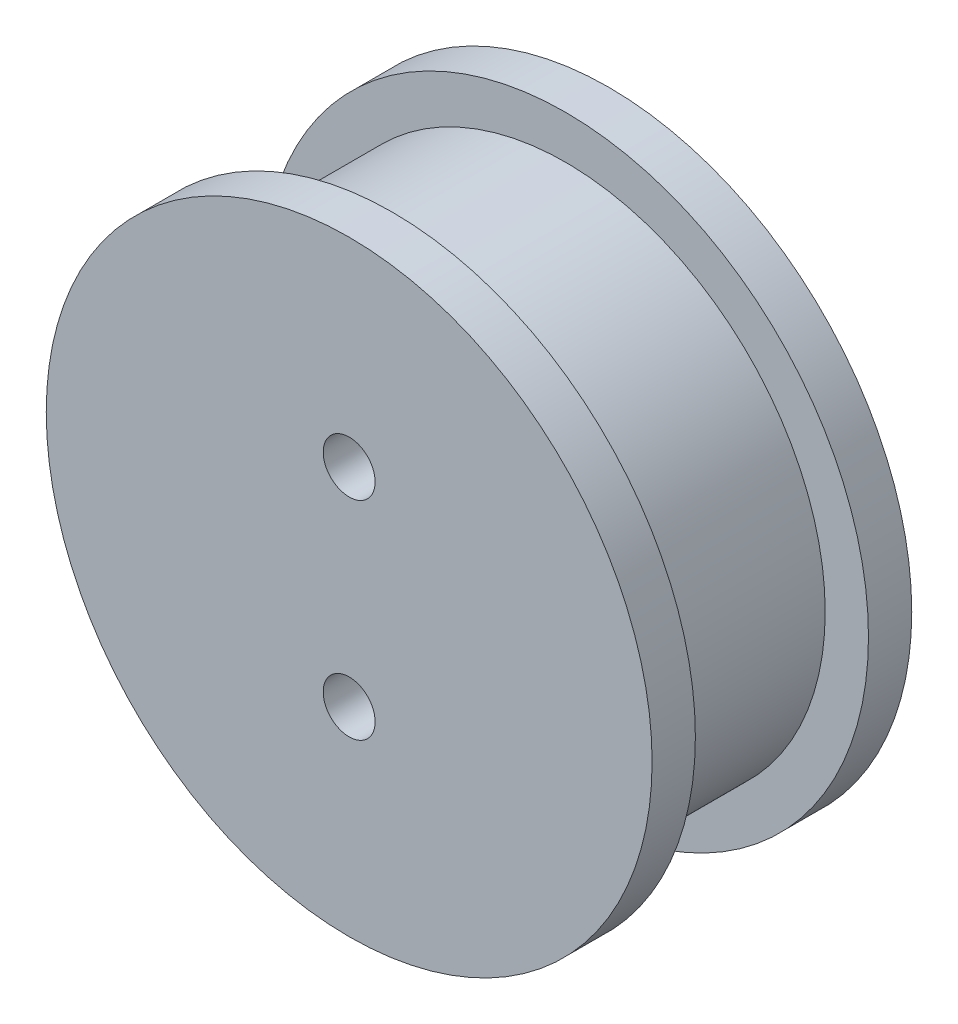
ISO-10303-21;
HEADER;
FILE_DESCRIPTION(('STEP AP214'),'2;1');
FILE_NAME('part.step','',(''),(''),'','','');
FILE_SCHEMA(('AUTOMOTIVE_DESIGN { 1 0 10303 214 1 1 1 1 }'));
ENDSEC;
DATA;
#1=APPLICATION_CONTEXT('core data for automotive mechanical design processes');
#2=APPLICATION_PROTOCOL_DEFINITION('international standard','automotive_design',2000,#1);
#3=PRODUCT_CONTEXT('',#1,'mechanical');
#4=PRODUCT('Part','Part','',(#3));
#5=PRODUCT_RELATED_PRODUCT_CATEGORY('part','',(#4));
#6=PRODUCT_DEFINITION_FORMATION('','',#4);
#7=PRODUCT_DEFINITION_CONTEXT('part definition',#1,'design');
#8=PRODUCT_DEFINITION('design','',#6,#7);
#9=PRODUCT_DEFINITION_SHAPE('','',#8);
#10=(LENGTH_UNIT() NAMED_UNIT(*) SI_UNIT(.MILLI.,.METRE.));
#11=(NAMED_UNIT(*) PLANE_ANGLE_UNIT() SI_UNIT($,.RADIAN.));
#12=(NAMED_UNIT(*) SI_UNIT($,.STERADIAN.) SOLID_ANGLE_UNIT());
#13=UNCERTAINTY_MEASURE_WITH_UNIT(LENGTH_MEASURE(1.E-05),#10,'distance_accuracy_value','');
#14=(GEOMETRIC_REPRESENTATION_CONTEXT(3) GLOBAL_UNCERTAINTY_ASSIGNED_CONTEXT((#13)) GLOBAL_UNIT_ASSIGNED_CONTEXT((#10,
#11,#12)) REPRESENTATION_CONTEXT('',''));
#15=CARTESIAN_POINT('',(0.,0.,0.));
#16=DIRECTION('',(0.,0.,1.));
#17=DIRECTION('',(1.,0.,0.));
#18=AXIS2_PLACEMENT_3D('',#15,#16,#17);
#19=CARTESIAN_POINT('',(0.,0.,7.5));
#20=DIRECTION('',(0.,0.,-1.));
#21=DIRECTION('',(-1.,0.,0.));
#22=AXIS2_PLACEMENT_3D('',#19,#20,#21);
#23=CYLINDRICAL_SURFACE('',#22,17.5);
#24=CARTESIAN_POINT('',(0.,0.,-7.5));
#25=DIRECTION('',(0.,0.,1.));
#26=DIRECTION('',(1.,0.,0.));
#27=AXIS2_PLACEMENT_3D('',#24,#25,#26);
#28=CIRCLE('',#27,17.5);
#29=CARTESIAN_POINT('',(17.5,0.,-7.5));
#30=VERTEX_POINT('',#29);
#31=EDGE_CURVE('E50',#30,#30,#28,.T.);
#32=ORIENTED_EDGE('',*,*,#31,.T.);
#33=EDGE_LOOP('',(#32));
#34=FACE_BOUND('',#33,.T.);
#35=CARTESIAN_POINT('',(0.,0.,-5.));
#36=DIRECTION('',(0.,0.,1.));
#37=DIRECTION('',(1.,0.,0.));
#38=AXIS2_PLACEMENT_3D('',#35,#36,#37);
#39=CIRCLE('',#38,17.5);
#40=CARTESIAN_POINT('',(17.5,0.,-5.));
#41=VERTEX_POINT('',#40);
#42=EDGE_CURVE('E55',#41,#41,#39,.T.);
#43=ORIENTED_EDGE('',*,*,#42,.F.);
#44=EDGE_LOOP('',(#43));
#45=FACE_BOUND('',#44,.T.);
#46=ADVANCED_FACE('F39',(#34,#45),#23,.T.);
#47=CARTESIAN_POINT('',(0.,0.,-7.5));
#48=DIRECTION('',(0.,0.,1.));
#49=DIRECTION('',(1.,0.,0.));
#50=AXIS2_PLACEMENT_3D('',#47,#48,#49);
#51=PLANE('',#50);
#52=CARTESIAN_POINT('',(0.,6.,-7.5));
#53=DIRECTION('',(0.,0.,1.));
#54=DIRECTION('',(1.,0.,0.));
#55=AXIS2_PLACEMENT_3D('',#52,#53,#54);
#56=CIRCLE('',#55,1.5);
#57=CARTESIAN_POINT('',(1.5,6.,-7.5));
#58=VERTEX_POINT('',#57);
#59=EDGE_CURVE('E69',#58,#58,#56,.T.);
#60=ORIENTED_EDGE('',*,*,#59,.T.);
#61=EDGE_LOOP('',(#60));
#62=FACE_BOUND('',#61,.T.);
#63=CARTESIAN_POINT('',(0.,-6.,-7.5));
#64=DIRECTION('',(0.,0.,1.));
#65=DIRECTION('',(1.,0.,0.));
#66=AXIS2_PLACEMENT_3D('',#63,#64,#65);
#67=CIRCLE('',#66,1.5);
#68=CARTESIAN_POINT('',(1.5,-6.,-7.5));
#69=VERTEX_POINT('',#68);
#70=EDGE_CURVE('E56',#69,#69,#67,.T.);
#71=ORIENTED_EDGE('',*,*,#70,.T.);
#72=EDGE_LOOP('',(#71));
#73=FACE_BOUND('',#72,.T.);
#74=ORIENTED_EDGE('',*,*,#31,.F.);
#75=EDGE_LOOP('',(#74));
#76=FACE_BOUND('',#75,.T.);
#77=ADVANCED_FACE('F100',(#62,#73,#76),#51,.F.);
#78=CARTESIAN_POINT('',(0.,0.,-5.));
#79=DIRECTION('',(0.,0.,1.));
#80=DIRECTION('',(1.,0.,0.));
#81=AXIS2_PLACEMENT_3D('',#78,#79,#80);
#82=PLANE('',#81);
#83=CARTESIAN_POINT('',(0.,0.,-5.));
#84=DIRECTION('',(0.,0.,1.));
#85=DIRECTION('',(1.,0.,0.));
#86=AXIS2_PLACEMENT_3D('',#83,#84,#85);
#87=CIRCLE('',#86,15.);
#88=CARTESIAN_POINT('',(15.,0.,-5.));
#89=VERTEX_POINT('',#88);
#90=EDGE_CURVE('E75',#89,#89,#87,.T.);
#91=ORIENTED_EDGE('',*,*,#90,.F.);
#92=EDGE_LOOP('',(#91));
#93=FACE_BOUND('',#92,.T.);
#94=ORIENTED_EDGE('',*,*,#42,.T.);
#95=EDGE_LOOP('',(#94));
#96=FACE_BOUND('',#95,.T.);
#97=ADVANCED_FACE('F87',(#93,#96),#82,.T.);
#98=CARTESIAN_POINT('',(0.,0.,5.));
#99=DIRECTION('',(0.,0.,1.));
#100=DIRECTION('',(1.,0.,0.));
#101=AXIS2_PLACEMENT_3D('',#98,#99,#100);
#102=PLANE('',#101);
#103=CARTESIAN_POINT('',(0.,0.,5.));
#104=DIRECTION('',(0.,0.,1.));
#105=DIRECTION('',(1.,0.,0.));
#106=AXIS2_PLACEMENT_3D('',#103,#104,#105);
#107=CIRCLE('',#106,15.);
#108=CARTESIAN_POINT('',(15.,0.,5.));
#109=VERTEX_POINT('',#108);
#110=EDGE_CURVE('E72',#109,#109,#107,.T.);
#111=ORIENTED_EDGE('',*,*,#110,.T.);
#112=EDGE_LOOP('',(#111));
#113=FACE_BOUND('',#112,.T.);
#114=CARTESIAN_POINT('',(0.,0.,5.));
#115=DIRECTION('',(0.,0.,1.));
#116=DIRECTION('',(1.,0.,0.));
#117=AXIS2_PLACEMENT_3D('',#114,#115,#116);
#118=CIRCLE('',#117,17.5);
#119=CARTESIAN_POINT('',(17.5,0.,5.));
#120=VERTEX_POINT('',#119);
#121=EDGE_CURVE('E54',#120,#120,#118,.T.);
#122=ORIENTED_EDGE('',*,*,#121,.F.);
#123=EDGE_LOOP('',(#122));
#124=FACE_BOUND('',#123,.T.);
#125=ADVANCED_FACE('F85',(#113,#124),#102,.F.);
#126=CARTESIAN_POINT('',(0.,0.,-5.));
#127=DIRECTION('',(0.,0.,1.));
#128=DIRECTION('',(1.,0.,0.));
#129=AXIS2_PLACEMENT_3D('',#126,#127,#128);
#130=CYLINDRICAL_SURFACE('',#129,15.);
#131=ORIENTED_EDGE('',*,*,#90,.T.);
#132=EDGE_LOOP('',(#131));
#133=FACE_BOUND('',#132,.T.);
#134=ORIENTED_EDGE('',*,*,#110,.F.);
#135=EDGE_LOOP('',(#134));
#136=FACE_BOUND('',#135,.T.);
#137=ADVANCED_FACE('F88',(#133,#136),#130,.T.);
#138=CARTESIAN_POINT('',(0.,0.,7.5));
#139=DIRECTION('',(0.,0.,1.));
#140=DIRECTION('',(1.,0.,0.));
#141=AXIS2_PLACEMENT_3D('',#138,#139,#140);
#142=PLANE('',#141);
#143=CARTESIAN_POINT('',(0.,6.,7.5));
#144=DIRECTION('',(0.,0.,1.));
#145=DIRECTION('',(1.,0.,0.));
#146=AXIS2_PLACEMENT_3D('',#143,#144,#145);
#147=CIRCLE('',#146,1.5);
#148=CARTESIAN_POINT('',(1.5,6.,7.5));
#149=VERTEX_POINT('',#148);
#150=EDGE_CURVE('E43',#149,#149,#147,.T.);
#151=ORIENTED_EDGE('',*,*,#150,.F.);
#152=EDGE_LOOP('',(#151));
#153=FACE_BOUND('',#152,.T.);
#154=CARTESIAN_POINT('',(0.,-6.,7.5));
#155=DIRECTION('',(0.,0.,1.));
#156=DIRECTION('',(1.,0.,0.));
#157=AXIS2_PLACEMENT_3D('',#154,#155,#156);
#158=CIRCLE('',#157,1.5);
#159=CARTESIAN_POINT('',(1.5,-6.,7.5));
#160=VERTEX_POINT('',#159);
#161=EDGE_CURVE('E60',#160,#160,#158,.T.);
#162=ORIENTED_EDGE('',*,*,#161,.F.);
#163=EDGE_LOOP('',(#162));
#164=FACE_BOUND('',#163,.T.);
#165=CARTESIAN_POINT('',(0.,0.,7.5));
#166=DIRECTION('',(0.,0.,1.));
#167=DIRECTION('',(1.,0.,0.));
#168=AXIS2_PLACEMENT_3D('',#165,#166,#167);
#169=CIRCLE('',#168,17.5);
#170=CARTESIAN_POINT('',(17.5,0.,7.5));
#171=VERTEX_POINT('',#170);
#172=EDGE_CURVE('E10',#171,#171,#169,.T.);
#173=ORIENTED_EDGE('',*,*,#172,.T.);
#174=EDGE_LOOP('',(#173));
#175=FACE_BOUND('',#174,.T.);
#176=ADVANCED_FACE('F94',(#153,#164,#175),#142,.T.);
#177=ORIENTED_EDGE('',*,*,#121,.T.);
#178=EDGE_LOOP('',(#177));
#179=FACE_BOUND('',#178,.T.);
#180=ORIENTED_EDGE('',*,*,#172,.F.);
#181=EDGE_LOOP('',(#180));
#182=FACE_BOUND('',#181,.T.);
#183=ADVANCED_FACE('F41',(#179,#182),#23,.T.);
#184=CARTESIAN_POINT('',(0.,-6.,-10.));
#185=DIRECTION('',(0.,0.,1.));
#186=DIRECTION('',(1.,0.,0.));
#187=AXIS2_PLACEMENT_3D('',#184,#185,#186);
#188=CYLINDRICAL_SURFACE('',#187,1.5);
#189=ORIENTED_EDGE('',*,*,#161,.T.);
#190=EDGE_LOOP('',(#189));
#191=FACE_BOUND('',#190,.T.);
#192=ORIENTED_EDGE('',*,*,#70,.F.);
#193=EDGE_LOOP('',(#192));
#194=FACE_BOUND('',#193,.T.);
#195=ADVANCED_FACE('F108',(#191,#194),#188,.F.);
#196=CARTESIAN_POINT('',(0.,6.,-10.));
#197=DIRECTION('',(0.,0.,1.));
#198=DIRECTION('',(1.,0.,0.));
#199=AXIS2_PLACEMENT_3D('',#196,#197,#198);
#200=CYLINDRICAL_SURFACE('',#199,1.5);
#201=ORIENTED_EDGE('',*,*,#150,.T.);
#202=EDGE_LOOP('',(#201));
#203=FACE_BOUND('',#202,.T.);
#204=ORIENTED_EDGE('',*,*,#59,.F.);
#205=EDGE_LOOP('',(#204));
#206=FACE_BOUND('',#205,.T.);
#207=ADVANCED_FACE('F114',(#203,#206),#200,.F.);
#208=CLOSED_SHELL('',(#46,#77,#97,#125,#137,#176,#183,#195,#207));
#209=MANIFOLD_SOLID_BREP('B2',#208);
#210=ADVANCED_BREP_SHAPE_REPRESENTATION('',(#18,#209),#14);
#211=SHAPE_DEFINITION_REPRESENTATION(#9,#210);
ENDSEC;
END-ISO-10303-21;
